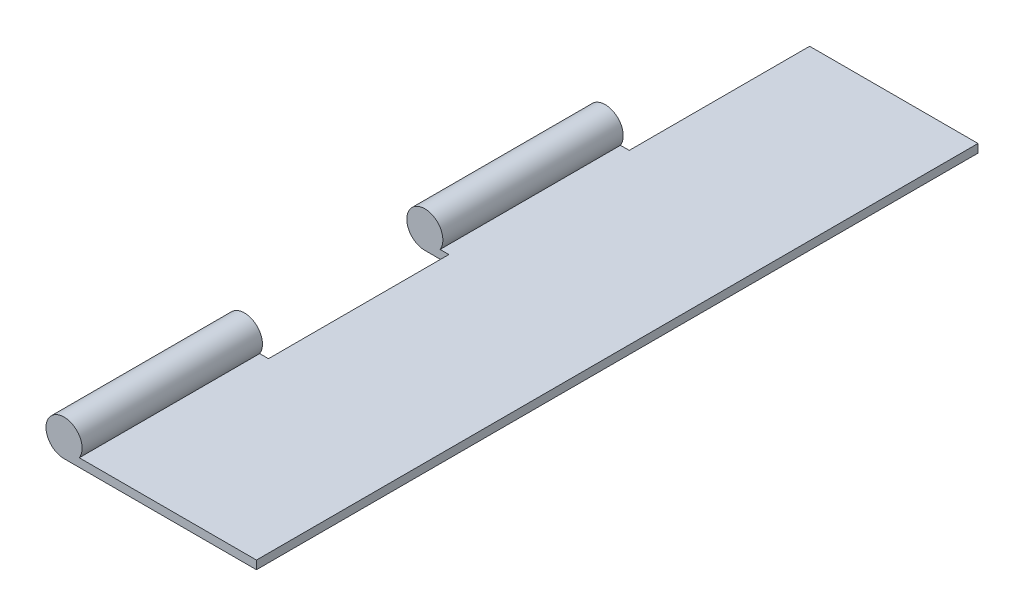
ISO-10303-21;
HEADER;
FILE_DESCRIPTION(('STEP AP214'),'2;1');
FILE_NAME('part.step','',(''),(''),'','','');
FILE_SCHEMA(('AUTOMOTIVE_DESIGN { 1 0 10303 214 1 1 1 1 }'));
ENDSEC;
DATA;
#1=APPLICATION_CONTEXT('core data for automotive mechanical design processes');
#2=APPLICATION_PROTOCOL_DEFINITION('international standard','automotive_design',2000,#1);
#3=PRODUCT_CONTEXT('',#1,'mechanical');
#4=PRODUCT('Part','Part','',(#3));
#5=PRODUCT_RELATED_PRODUCT_CATEGORY('part','',(#4));
#6=PRODUCT_DEFINITION_FORMATION('','',#4);
#7=PRODUCT_DEFINITION_CONTEXT('part definition',#1,'design');
#8=PRODUCT_DEFINITION('design','',#6,#7);
#9=PRODUCT_DEFINITION_SHAPE('','',#8);
#10=(LENGTH_UNIT() NAMED_UNIT(*) SI_UNIT(.MILLI.,.METRE.));
#11=(NAMED_UNIT(*) PLANE_ANGLE_UNIT() SI_UNIT($,.RADIAN.));
#12=(NAMED_UNIT(*) SI_UNIT($,.STERADIAN.) SOLID_ANGLE_UNIT());
#13=UNCERTAINTY_MEASURE_WITH_UNIT(LENGTH_MEASURE(1.E-05),#10,'distance_accuracy_value','');
#14=(GEOMETRIC_REPRESENTATION_CONTEXT(3) GLOBAL_UNCERTAINTY_ASSIGNED_CONTEXT((#13)) GLOBAL_UNIT_ASSIGNED_CONTEXT((#10,
#11,#12)) REPRESENTATION_CONTEXT('',''));
#15=CARTESIAN_POINT('',(0.,0.,0.));
#16=DIRECTION('',(0.,0.,1.));
#17=DIRECTION('',(1.,0.,0.));
#18=AXIS2_PLACEMENT_3D('',#15,#16,#17);
#19=CARTESIAN_POINT('',(0.,1.5,60.));
#20=DIRECTION('',(0.,0.,-1.));
#21=DIRECTION('',(-1.,0.,0.));
#22=AXIS2_PLACEMENT_3D('',#19,#20,#21);
#23=CYLINDRICAL_SURFACE('',#22,1.5);
#24=DIRECTION('',(0.,0.,-1.));
#25=VECTOR('',#24,1.);
#26=CARTESIAN_POINT('',(1.26885775404495,0.7,60.));
#27=LINE('',#26,#25);
#28=CARTESIAN_POINT('',(1.26885775404495,0.7,30.));
#29=VERTEX_POINT('',#28);
#30=CARTESIAN_POINT('',(1.26885775404495,0.7,15.));
#31=VERTEX_POINT('',#30);
#32=EDGE_CURVE('E142',#29,#31,#27,.T.);
#33=ORIENTED_EDGE('',*,*,#32,.T.);
#34=CARTESIAN_POINT('',(0.,1.5,15.));
#35=DIRECTION('',(0.,0.,-1.));
#36=DIRECTION('',(-1.,0.,0.));
#37=AXIS2_PLACEMENT_3D('',#34,#35,#36);
#38=CIRCLE('',#37,1.5);
#39=CARTESIAN_POINT('',(0.,0.,15.));
#40=VERTEX_POINT('',#39);
#41=EDGE_CURVE('E121',#40,#31,#38,.T.);
#42=ORIENTED_EDGE('',*,*,#41,.F.);
#43=DIRECTION('',(0.,0.,-1.));
#44=VECTOR('',#43,1.);
#45=CARTESIAN_POINT('',(0.,0.,60.));
#46=LINE('',#45,#44);
#47=CARTESIAN_POINT('',(0.,0.,30.));
#48=VERTEX_POINT('',#47);
#49=EDGE_CURVE('E147',#48,#40,#46,.T.);
#50=ORIENTED_EDGE('',*,*,#49,.F.);
#51=CARTESIAN_POINT('',(0.,1.5,30.));
#52=DIRECTION('',(0.,0.,1.));
#53=DIRECTION('',(1.,0.,0.));
#54=AXIS2_PLACEMENT_3D('',#51,#52,#53);
#55=CIRCLE('',#54,1.5);
#56=EDGE_CURVE('E161',#29,#48,#55,.T.);
#57=ORIENTED_EDGE('',*,*,#56,.F.);
#58=EDGE_LOOP('',(#33,#42,#50,#57));
#59=FACE_BOUND('',#58,.T.);
#60=ADVANCED_FACE('F31',(#59),#23,.T.);
#61=CARTESIAN_POINT('',(0.,0.,60.));
#62=DIRECTION('',(0.,1.,0.));
#63=DIRECTION('',(0.,0.,1.));
#64=AXIS2_PLACEMENT_3D('',#61,#62,#63);
#65=PLANE('',#64);
#66=DIRECTION('',(0.,0.,1.));
#67=VECTOR('',#66,1.);
#68=CARTESIAN_POINT('',(2.,0.,60.));
#69=LINE('',#68,#67);
#70=CARTESIAN_POINT('',(2.,0.,0.));
#71=VERTEX_POINT('',#70);
#72=CARTESIAN_POINT('',(2.,0.,15.));
#73=VERTEX_POINT('',#72);
#74=EDGE_CURVE('E106',#71,#73,#69,.T.);
#75=ORIENTED_EDGE('',*,*,#74,.F.);
#76=DIRECTION('',(1.,0.,0.));
#77=VECTOR('',#76,1.);
#78=CARTESIAN_POINT('',(0.,0.,0.));
#79=LINE('',#78,#77);
#80=CARTESIAN_POINT('',(16.,0.,0.));
#81=VERTEX_POINT('',#80);
#82=EDGE_CURVE('E117',#71,#81,#79,.T.);
#83=ORIENTED_EDGE('',*,*,#82,.T.);
#84=DIRECTION('',(0.,0.,-1.));
#85=VECTOR('',#84,1.);
#86=CARTESIAN_POINT('',(16.,0.,60.));
#87=LINE('',#86,#85);
#88=CARTESIAN_POINT('',(16.,0.,60.));
#89=VERTEX_POINT('',#88);
#90=EDGE_CURVE('E145',#89,#81,#87,.T.);
#91=ORIENTED_EDGE('',*,*,#90,.F.);
#92=DIRECTION('',(1.,0.,0.));
#93=VECTOR('',#92,1.);
#94=CARTESIAN_POINT('',(0.,0.,60.));
#95=LINE('',#94,#93);
#96=CARTESIAN_POINT('',(0.,0.,60.));
#97=VERTEX_POINT('',#96);
#98=EDGE_CURVE('E177',#97,#89,#95,.T.);
#99=ORIENTED_EDGE('',*,*,#98,.F.);
#100=CARTESIAN_POINT('',(0.,0.,45.));
#101=VERTEX_POINT('',#100);
#102=EDGE_CURVE('E148',#97,#101,#46,.T.);
#103=ORIENTED_EDGE('',*,*,#102,.T.);
#104=DIRECTION('',(-1.,0.,0.));
#105=VECTOR('',#104,1.);
#106=CARTESIAN_POINT('',(0.,0.,45.));
#107=LINE('',#106,#105);
#108=CARTESIAN_POINT('',(2.,0.,45.));
#109=VERTEX_POINT('',#108);
#110=EDGE_CURVE('E185',#109,#101,#107,.T.);
#111=ORIENTED_EDGE('',*,*,#110,.F.);
#112=DIRECTION('',(0.,0.,1.));
#113=VECTOR('',#112,1.);
#114=CARTESIAN_POINT('',(2.,0.,60.));
#115=LINE('',#114,#113);
#116=CARTESIAN_POINT('',(2.,0.,30.));
#117=VERTEX_POINT('',#116);
#118=EDGE_CURVE('E126',#117,#109,#115,.T.);
#119=ORIENTED_EDGE('',*,*,#118,.F.);
#120=DIRECTION('',(1.,0.,0.));
#121=VECTOR('',#120,1.);
#122=CARTESIAN_POINT('',(0.,0.,30.));
#123=LINE('',#122,#121);
#124=EDGE_CURVE('E130',#48,#117,#123,.T.);
#125=ORIENTED_EDGE('',*,*,#124,.F.);
#126=ORIENTED_EDGE('',*,*,#49,.T.);
#127=DIRECTION('',(-1.,0.,0.));
#128=VECTOR('',#127,1.);
#129=CARTESIAN_POINT('',(0.,0.,15.));
#130=LINE('',#129,#128);
#131=EDGE_CURVE('E120',#73,#40,#130,.T.);
#132=ORIENTED_EDGE('',*,*,#131,.F.);
#133=EDGE_LOOP('',(#75,#83,#91,#99,#103,#111,#119,#125,#126,#132));
#134=FACE_BOUND('',#133,.T.);
#135=ADVANCED_FACE('F115',(#134),#65,.F.);
#136=CARTESIAN_POINT('',(1.26885775404495,0.7,60.));
#137=DIRECTION('',(0.,-1.,0.));
#138=DIRECTION('',(1.,0.,0.));
#139=AXIS2_PLACEMENT_3D('',#136,#137,#138);
#140=PLANE('',#139);
#141=DIRECTION('',(0.,0.,-1.));
#142=VECTOR('',#141,1.);
#143=CARTESIAN_POINT('',(2.,0.7,60.));
#144=LINE('',#143,#142);
#145=CARTESIAN_POINT('',(2.,0.7,15.));
#146=VERTEX_POINT('',#145);
#147=CARTESIAN_POINT('',(2.,0.7,0.));
#148=VERTEX_POINT('',#147);
#149=EDGE_CURVE('E45',#146,#148,#144,.T.);
#150=ORIENTED_EDGE('',*,*,#149,.F.);
#151=DIRECTION('',(1.,0.,0.));
#152=VECTOR('',#151,1.);
#153=CARTESIAN_POINT('',(1.26885775404495,0.7,15.));
#154=LINE('',#153,#152);
#155=EDGE_CURVE('E11',#31,#146,#154,.T.);
#156=ORIENTED_EDGE('',*,*,#155,.F.);
#157=ORIENTED_EDGE('',*,*,#32,.F.);
#158=DIRECTION('',(-1.,0.,0.));
#159=VECTOR('',#158,1.);
#160=CARTESIAN_POINT('',(1.26885775404495,0.7,30.));
#161=LINE('',#160,#159);
#162=CARTESIAN_POINT('',(2.,0.7,30.));
#163=VERTEX_POINT('',#162);
#164=EDGE_CURVE('E112',#163,#29,#161,.T.);
#165=ORIENTED_EDGE('',*,*,#164,.F.);
#166=DIRECTION('',(0.,0.,-1.));
#167=VECTOR('',#166,1.);
#168=CARTESIAN_POINT('',(2.,0.7,60.));
#169=LINE('',#168,#167);
#170=CARTESIAN_POINT('',(2.,0.7,45.));
#171=VERTEX_POINT('',#170);
#172=EDGE_CURVE('E153',#171,#163,#169,.T.);
#173=ORIENTED_EDGE('',*,*,#172,.F.);
#174=DIRECTION('',(1.,0.,0.));
#175=VECTOR('',#174,1.);
#176=CARTESIAN_POINT('',(1.26885775404495,0.7,45.));
#177=LINE('',#176,#175);
#178=CARTESIAN_POINT('',(1.26885775404495,0.7,45.));
#179=VERTEX_POINT('',#178);
#180=EDGE_CURVE('E151',#179,#171,#177,.T.);
#181=ORIENTED_EDGE('',*,*,#180,.F.);
#182=CARTESIAN_POINT('',(1.26885775404495,0.7,60.));
#183=VERTEX_POINT('',#182);
#184=EDGE_CURVE('E138',#183,#179,#27,.T.);
#185=ORIENTED_EDGE('',*,*,#184,.F.);
#186=DIRECTION('',(-1.,0.,0.));
#187=VECTOR('',#186,1.);
#188=CARTESIAN_POINT('',(1.26885775404495,0.7,60.));
#189=LINE('',#188,#187);
#190=CARTESIAN_POINT('',(16.,0.7,60.));
#191=VERTEX_POINT('',#190);
#192=EDGE_CURVE('E133',#191,#183,#189,.T.);
#193=ORIENTED_EDGE('',*,*,#192,.F.);
#194=DIRECTION('',(0.,0.,-1.));
#195=VECTOR('',#194,1.);
#196=CARTESIAN_POINT('',(16.,0.7,60.));
#197=LINE('',#196,#195);
#198=CARTESIAN_POINT('',(16.,0.7,0.));
#199=VERTEX_POINT('',#198);
#200=EDGE_CURVE('E141',#191,#199,#197,.T.);
#201=ORIENTED_EDGE('',*,*,#200,.T.);
#202=DIRECTION('',(-1.,0.,0.));
#203=VECTOR('',#202,1.);
#204=CARTESIAN_POINT('',(1.26885775404495,0.7,0.));
#205=LINE('',#204,#203);
#206=EDGE_CURVE('E128',#199,#148,#205,.T.);
#207=ORIENTED_EDGE('',*,*,#206,.T.);
#208=EDGE_LOOP('',(#150,#156,#157,#165,#173,#181,#185,#193,#201,#207));
#209=FACE_BOUND('',#208,.T.);
#210=ADVANCED_FACE('F169',(#209),#140,.F.);
#211=CARTESIAN_POINT('',(0.,1.5,0.));
#212=DIRECTION('',(0.,0.,1.));
#213=DIRECTION('',(1.,0.,0.));
#214=AXIS2_PLACEMENT_3D('',#211,#212,#213);
#215=PLANE('',#214);
#216=DIRECTION('',(0.,-1.,0.));
#217=VECTOR('',#216,1.);
#218=CARTESIAN_POINT('',(2.,1.5,0.));
#219=LINE('',#218,#217);
#220=EDGE_CURVE('E38',#148,#71,#219,.T.);
#221=ORIENTED_EDGE('',*,*,#220,.F.);
#222=ORIENTED_EDGE('',*,*,#206,.F.);
#223=DIRECTION('',(0.,1.,0.));
#224=VECTOR('',#223,1.);
#225=CARTESIAN_POINT('',(16.,0.,0.));
#226=LINE('',#225,#224);
#227=EDGE_CURVE('E125',#81,#199,#226,.T.);
#228=ORIENTED_EDGE('',*,*,#227,.F.);
#229=ORIENTED_EDGE('',*,*,#82,.F.);
#230=EDGE_LOOP('',(#221,#222,#228,#229));
#231=FACE_BOUND('',#230,.T.);
#232=ADVANCED_FACE('F124',(#231),#215,.F.);
#233=ORIENTED_EDGE('',*,*,#184,.T.);
#234=CARTESIAN_POINT('',(0.,1.5,45.));
#235=DIRECTION('',(0.,0.,-1.));
#236=DIRECTION('',(-1.,0.,0.));
#237=AXIS2_PLACEMENT_3D('',#234,#235,#236);
#238=CIRCLE('',#237,1.5);
#239=EDGE_CURVE('E53',#101,#179,#238,.T.);
#240=ORIENTED_EDGE('',*,*,#239,.F.);
#241=ORIENTED_EDGE('',*,*,#102,.F.);
#242=CARTESIAN_POINT('',(0.,1.5,60.));
#243=DIRECTION('',(0.,0.,1.));
#244=DIRECTION('',(1.,0.,0.));
#245=AXIS2_PLACEMENT_3D('',#242,#243,#244);
#246=CIRCLE('',#245,1.5);
#247=EDGE_CURVE('E137',#183,#97,#246,.T.);
#248=ORIENTED_EDGE('',*,*,#247,.F.);
#249=EDGE_LOOP('',(#233,#240,#241,#248));
#250=FACE_BOUND('',#249,.T.);
#251=ADVANCED_FACE('F205',(#250),#23,.T.);
#252=CARTESIAN_POINT('',(16.,0.,60.));
#253=DIRECTION('',(-1.,0.,0.));
#254=DIRECTION('',(0.,0.,1.));
#255=AXIS2_PLACEMENT_3D('',#252,#253,#254);
#256=PLANE('',#255);
#257=ORIENTED_EDGE('',*,*,#227,.T.);
#258=ORIENTED_EDGE('',*,*,#200,.F.);
#259=DIRECTION('',(0.,1.,0.));
#260=VECTOR('',#259,1.);
#261=CARTESIAN_POINT('',(16.,0.,60.));
#262=LINE('',#261,#260);
#263=EDGE_CURVE('E172',#89,#191,#262,.T.);
#264=ORIENTED_EDGE('',*,*,#263,.F.);
#265=ORIENTED_EDGE('',*,*,#90,.T.);
#266=EDGE_LOOP('',(#257,#258,#264,#265));
#267=FACE_BOUND('',#266,.T.);
#268=ADVANCED_FACE('F199',(#267),#256,.F.);
#269=CARTESIAN_POINT('',(0.,1.5,60.));
#270=DIRECTION('',(0.,0.,1.));
#271=DIRECTION('',(1.,0.,0.));
#272=AXIS2_PLACEMENT_3D('',#269,#270,#271);
#273=PLANE('',#272);
#274=ORIENTED_EDGE('',*,*,#247,.T.);
#275=ORIENTED_EDGE('',*,*,#98,.T.);
#276=ORIENTED_EDGE('',*,*,#263,.T.);
#277=ORIENTED_EDGE('',*,*,#192,.T.);
#278=EDGE_LOOP('',(#274,#275,#276,#277));
#279=FACE_BOUND('',#278,.T.);
#280=ADVANCED_FACE('F203',(#279),#273,.T.);
#281=CARTESIAN_POINT('',(2.,3.,45.));
#282=DIRECTION('',(-1.,0.,0.));
#283=DIRECTION('',(0.,-1.,0.));
#284=AXIS2_PLACEMENT_3D('',#281,#282,#283);
#285=PLANE('',#284);
#286=ORIENTED_EDGE('',*,*,#118,.T.);
#287=DIRECTION('',(0.,-1.,0.));
#288=VECTOR('',#287,1.);
#289=CARTESIAN_POINT('',(2.,3.,45.));
#290=LINE('',#289,#288);
#291=EDGE_CURVE('E189',#171,#109,#290,.T.);
#292=ORIENTED_EDGE('',*,*,#291,.F.);
#293=ORIENTED_EDGE('',*,*,#172,.T.);
#294=DIRECTION('',(0.,-1.,0.));
#295=VECTOR('',#294,1.);
#296=CARTESIAN_POINT('',(2.,3.,30.));
#297=LINE('',#296,#295);
#298=EDGE_CURVE('E164',#163,#117,#297,.T.);
#299=ORIENTED_EDGE('',*,*,#298,.T.);
#300=EDGE_LOOP('',(#286,#292,#293,#299));
#301=FACE_BOUND('',#300,.T.);
#302=ADVANCED_FACE('F209',(#301),#285,.T.);
#303=CARTESIAN_POINT('',(2.,3.,30.));
#304=DIRECTION('',(0.,0.,1.));
#305=DIRECTION('',(1.,0.,0.));
#306=AXIS2_PLACEMENT_3D('',#303,#304,#305);
#307=PLANE('',#306);
#308=ORIENTED_EDGE('',*,*,#124,.T.);
#309=ORIENTED_EDGE('',*,*,#298,.F.);
#310=ORIENTED_EDGE('',*,*,#164,.T.);
#311=ORIENTED_EDGE('',*,*,#56,.T.);
#312=EDGE_LOOP('',(#308,#309,#310,#311));
#313=FACE_BOUND('',#312,.T.);
#314=ADVANCED_FACE('F160',(#313),#307,.T.);
#315=CARTESIAN_POINT('',(2.,3.,45.));
#316=DIRECTION('',(0.,0.,-1.));
#317=DIRECTION('',(-1.,0.,0.));
#318=AXIS2_PLACEMENT_3D('',#315,#316,#317);
#319=PLANE('',#318);
#320=ORIENTED_EDGE('',*,*,#110,.T.);
#321=ORIENTED_EDGE('',*,*,#239,.T.);
#322=ORIENTED_EDGE('',*,*,#180,.T.);
#323=ORIENTED_EDGE('',*,*,#291,.T.);
#324=EDGE_LOOP('',(#320,#321,#322,#323));
#325=FACE_BOUND('',#324,.T.);
#326=ADVANCED_FACE('F207',(#325),#319,.T.);
#327=CARTESIAN_POINT('',(2.,3.,15.));
#328=DIRECTION('',(0.,0.,-1.));
#329=DIRECTION('',(-1.,0.,0.));
#330=AXIS2_PLACEMENT_3D('',#327,#328,#329);
#331=PLANE('',#330);
#332=ORIENTED_EDGE('',*,*,#131,.T.);
#333=ORIENTED_EDGE('',*,*,#41,.T.);
#334=ORIENTED_EDGE('',*,*,#155,.T.);
#335=DIRECTION('',(0.,-1.,0.));
#336=VECTOR('',#335,1.);
#337=CARTESIAN_POINT('',(2.,3.,15.));
#338=LINE('',#337,#336);
#339=EDGE_CURVE('E195',#146,#73,#338,.T.);
#340=ORIENTED_EDGE('',*,*,#339,.T.);
#341=EDGE_LOOP('',(#332,#333,#334,#340));
#342=FACE_BOUND('',#341,.T.);
#343=ADVANCED_FACE('F197',(#342),#331,.T.);
#344=CARTESIAN_POINT('',(2.,3.,15.));
#345=DIRECTION('',(-1.,0.,0.));
#346=DIRECTION('',(0.,-1.,0.));
#347=AXIS2_PLACEMENT_3D('',#344,#345,#346);
#348=PLANE('',#347);
#349=ORIENTED_EDGE('',*,*,#74,.T.);
#350=ORIENTED_EDGE('',*,*,#339,.F.);
#351=ORIENTED_EDGE('',*,*,#149,.T.);
#352=ORIENTED_EDGE('',*,*,#220,.T.);
#353=EDGE_LOOP('',(#349,#350,#351,#352));
#354=FACE_BOUND('',#353,.T.);
#355=ADVANCED_FACE('F105',(#354),#348,.T.);
#356=CLOSED_SHELL('',(#60,#135,#210,#232,#251,#268,#280,#302,#314,#326,#343,#355));
#357=MANIFOLD_SOLID_BREP('B2',#356);
#358=ADVANCED_BREP_SHAPE_REPRESENTATION('',(#18,#357),#14);
#359=SHAPE_DEFINITION_REPRESENTATION(#9,#358);
ENDSEC;
END-ISO-10303-21;
